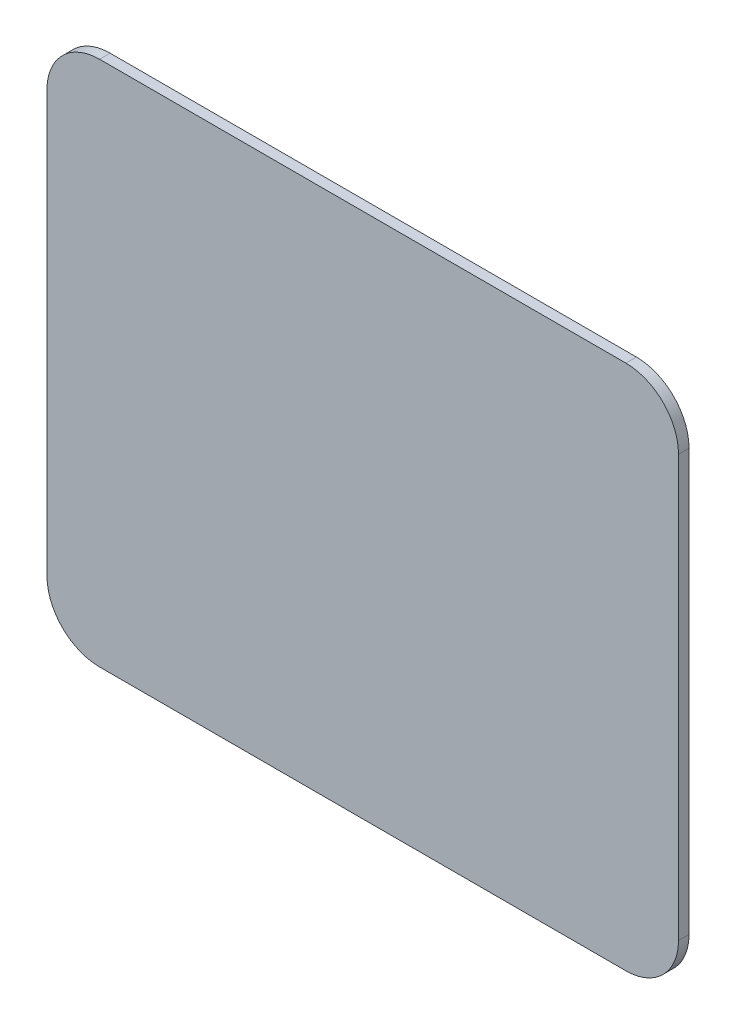
ISO-10303-21;
HEADER;
FILE_DESCRIPTION(('STEP AP214'),'2;1');
FILE_NAME('part.step','',(''),(''),'','','');
FILE_SCHEMA(('AUTOMOTIVE_DESIGN { 1 0 10303 214 1 1 1 1 }'));
ENDSEC;
DATA;
#1=APPLICATION_CONTEXT('core data for automotive mechanical design processes');
#2=APPLICATION_PROTOCOL_DEFINITION('international standard','automotive_design',2000,#1);
#3=PRODUCT_CONTEXT('',#1,'mechanical');
#4=PRODUCT('Part','Part','',(#3));
#5=PRODUCT_RELATED_PRODUCT_CATEGORY('part','',(#4));
#6=PRODUCT_DEFINITION_FORMATION('','',#4);
#7=PRODUCT_DEFINITION_CONTEXT('part definition',#1,'design');
#8=PRODUCT_DEFINITION('design','',#6,#7);
#9=PRODUCT_DEFINITION_SHAPE('','',#8);
#10=(LENGTH_UNIT() NAMED_UNIT(*) SI_UNIT(.MILLI.,.METRE.));
#11=(NAMED_UNIT(*) PLANE_ANGLE_UNIT() SI_UNIT($,.RADIAN.));
#12=(NAMED_UNIT(*) SI_UNIT($,.STERADIAN.) SOLID_ANGLE_UNIT());
#13=UNCERTAINTY_MEASURE_WITH_UNIT(LENGTH_MEASURE(1.E-05),#10,'distance_accuracy_value','');
#14=(GEOMETRIC_REPRESENTATION_CONTEXT(3) GLOBAL_UNCERTAINTY_ASSIGNED_CONTEXT((#13)) GLOBAL_UNIT_ASSIGNED_CONTEXT((#10,
#11,#12)) REPRESENTATION_CONTEXT('',''));
#15=CARTESIAN_POINT('',(0.,0.,0.));
#16=DIRECTION('',(0.,0.,1.));
#17=DIRECTION('',(1.,0.,0.));
#18=AXIS2_PLACEMENT_3D('',#15,#16,#17);
#19=CARTESIAN_POINT('',(0.,0.,0.1));
#20=DIRECTION('',(0.,0.,1.));
#21=DIRECTION('',(1.,0.,0.));
#22=AXIS2_PLACEMENT_3D('',#19,#20,#21);
#23=PLANE('',#22);
#24=DIRECTION('',(1.,0.,0.));
#25=VECTOR('',#24,1.);
#26=CARTESIAN_POINT('',(2.5,2.5,0.1));
#27=LINE('',#26,#25);
#28=CARTESIAN_POINT('',(-2.5,2.5,0.1));
#29=VERTEX_POINT('',#28);
#30=CARTESIAN_POINT('',(2.5,2.5,0.1));
#31=VERTEX_POINT('',#30);
#32=EDGE_CURVE('E91',#29,#31,#27,.T.);
#33=ORIENTED_EDGE('',*,*,#32,.F.);
#34=CARTESIAN_POINT('',(-2.5,2.,0.1));
#35=DIRECTION('',(0.,0.,1.));
#36=DIRECTION('',(1.,0.,0.));
#37=AXIS2_PLACEMENT_3D('',#34,#35,#36);
#38=CIRCLE('',#37,0.5);
#39=CARTESIAN_POINT('',(-3.,2.,0.1));
#40=VERTEX_POINT('',#39);
#41=EDGE_CURVE('E19',#40,#29,#38,.F.);
#42=ORIENTED_EDGE('',*,*,#41,.F.);
#43=DIRECTION('',(0.,1.,0.));
#44=VECTOR('',#43,1.);
#45=CARTESIAN_POINT('',(-3.,2.,0.1));
#46=LINE('',#45,#44);
#47=CARTESIAN_POINT('',(-3.,-2.,0.1));
#48=VERTEX_POINT('',#47);
#49=EDGE_CURVE('E77',#48,#40,#46,.T.);
#50=ORIENTED_EDGE('',*,*,#49,.F.);
#51=CARTESIAN_POINT('',(-2.5,-2.,0.1));
#52=DIRECTION('',(0.,0.,1.));
#53=DIRECTION('',(1.,0.,0.));
#54=AXIS2_PLACEMENT_3D('',#51,#52,#53);
#55=CIRCLE('',#54,0.5);
#56=CARTESIAN_POINT('',(-2.5,-2.5,0.1));
#57=VERTEX_POINT('',#56);
#58=EDGE_CURVE('E98',#57,#48,#55,.F.);
#59=ORIENTED_EDGE('',*,*,#58,.F.);
#60=DIRECTION('',(1.,0.,0.));
#61=VECTOR('',#60,1.);
#62=CARTESIAN_POINT('',(-2.5,-2.5,0.1));
#63=LINE('',#62,#61);
#64=CARTESIAN_POINT('',(2.5,-2.5,0.1));
#65=VERTEX_POINT('',#64);
#66=EDGE_CURVE('E109',#65,#57,#63,.F.);
#67=ORIENTED_EDGE('',*,*,#66,.F.);
#68=CARTESIAN_POINT('',(2.5,-2.,0.1));
#69=DIRECTION('',(0.,0.,1.));
#70=DIRECTION('',(1.,0.,0.));
#71=AXIS2_PLACEMENT_3D('',#68,#69,#70);
#72=CIRCLE('',#71,0.5);
#73=CARTESIAN_POINT('',(3.,-2.,0.1));
#74=VERTEX_POINT('',#73);
#75=EDGE_CURVE('E127',#74,#65,#72,.F.);
#76=ORIENTED_EDGE('',*,*,#75,.F.);
#77=DIRECTION('',(0.,1.,0.));
#78=VECTOR('',#77,1.);
#79=CARTESIAN_POINT('',(3.,-2.,0.1));
#80=LINE('',#79,#78);
#81=CARTESIAN_POINT('',(3.,2.,0.1));
#82=VERTEX_POINT('',#81);
#83=EDGE_CURVE('E105',#82,#74,#80,.F.);
#84=ORIENTED_EDGE('',*,*,#83,.F.);
#85=CARTESIAN_POINT('',(2.5,2.,0.1));
#86=DIRECTION('',(0.,0.,1.));
#87=DIRECTION('',(1.,0.,0.));
#88=AXIS2_PLACEMENT_3D('',#85,#86,#87);
#89=CIRCLE('',#88,0.5);
#90=EDGE_CURVE('E124',#31,#82,#89,.F.);
#91=ORIENTED_EDGE('',*,*,#90,.F.);
#92=EDGE_LOOP('',(#33,#42,#50,#59,#67,#76,#84,#91));
#93=FACE_BOUND('',#92,.T.);
#94=ADVANCED_FACE('F16',(#93),#23,.T.);
#95=CARTESIAN_POINT('',(-2.5,2.,0.));
#96=DIRECTION('',(0.,0.,1.));
#97=DIRECTION('',(1.,0.,0.));
#98=AXIS2_PLACEMENT_3D('',#95,#96,#97);
#99=CYLINDRICAL_SURFACE('',#98,0.5);
#100=DIRECTION('',(0.,0.,1.));
#101=VECTOR('',#100,1.);
#102=CARTESIAN_POINT('',(-2.5,2.5,0.));
#103=LINE('',#102,#101);
#104=CARTESIAN_POINT('',(-2.5,2.5,0.));
#105=VERTEX_POINT('',#104);
#106=EDGE_CURVE('E104',#105,#29,#103,.T.);
#107=ORIENTED_EDGE('',*,*,#106,.F.);
#108=CARTESIAN_POINT('',(-2.5,2.,0.));
#109=DIRECTION('',(0.,0.,1.));
#110=DIRECTION('',(1.,0.,0.));
#111=AXIS2_PLACEMENT_3D('',#108,#109,#110);
#112=CIRCLE('',#111,0.5);
#113=CARTESIAN_POINT('',(-3.,2.,0.));
#114=VERTEX_POINT('',#113);
#115=EDGE_CURVE('E97',#105,#114,#112,.T.);
#116=ORIENTED_EDGE('',*,*,#115,.T.);
#117=DIRECTION('',(0.,0.,1.));
#118=VECTOR('',#117,1.);
#119=CARTESIAN_POINT('',(-3.,2.,0.));
#120=LINE('',#119,#118);
#121=EDGE_CURVE('E82',#40,#114,#120,.F.);
#122=ORIENTED_EDGE('',*,*,#121,.F.);
#123=ORIENTED_EDGE('',*,*,#41,.T.);
#124=EDGE_LOOP('',(#107,#116,#122,#123));
#125=FACE_BOUND('',#124,.T.);
#126=ADVANCED_FACE('F96',(#125),#99,.T.);
#127=CARTESIAN_POINT('',(-3.,2.,0.));
#128=DIRECTION('',(-1.,0.,0.));
#129=DIRECTION('',(0.,0.,1.));
#130=AXIS2_PLACEMENT_3D('',#127,#128,#129);
#131=PLANE('',#130);
#132=ORIENTED_EDGE('',*,*,#121,.T.);
#133=DIRECTION('',(0.,1.,0.));
#134=VECTOR('',#133,1.);
#135=CARTESIAN_POINT('',(-3.,0.,0.));
#136=LINE('',#135,#134);
#137=CARTESIAN_POINT('',(-3.,-2.,0.));
#138=VERTEX_POINT('',#137);
#139=EDGE_CURVE('E122',#114,#138,#136,.F.);
#140=ORIENTED_EDGE('',*,*,#139,.T.);
#141=DIRECTION('',(0.,0.,1.));
#142=VECTOR('',#141,1.);
#143=CARTESIAN_POINT('',(-3.,-2.,0.));
#144=LINE('',#143,#142);
#145=EDGE_CURVE('E84',#48,#138,#144,.F.);
#146=ORIENTED_EDGE('',*,*,#145,.F.);
#147=ORIENTED_EDGE('',*,*,#49,.T.);
#148=EDGE_LOOP('',(#132,#140,#146,#147));
#149=FACE_BOUND('',#148,.T.);
#150=ADVANCED_FACE('F79',(#149),#131,.T.);
#151=CARTESIAN_POINT('',(-2.5,-2.,0.));
#152=DIRECTION('',(0.,0.,1.));
#153=DIRECTION('',(1.,0.,0.));
#154=AXIS2_PLACEMENT_3D('',#151,#152,#153);
#155=CYLINDRICAL_SURFACE('',#154,0.5);
#156=ORIENTED_EDGE('',*,*,#145,.T.);
#157=CARTESIAN_POINT('',(-2.5,-2.,0.));
#158=DIRECTION('',(0.,0.,1.));
#159=DIRECTION('',(1.,0.,0.));
#160=AXIS2_PLACEMENT_3D('',#157,#158,#159);
#161=CIRCLE('',#160,0.5);
#162=CARTESIAN_POINT('',(-2.5,-2.5,0.));
#163=VERTEX_POINT('',#162);
#164=EDGE_CURVE('E119',#138,#163,#161,.T.);
#165=ORIENTED_EDGE('',*,*,#164,.T.);
#166=DIRECTION('',(0.,0.,-1.));
#167=VECTOR('',#166,1.);
#168=CARTESIAN_POINT('',(-2.5,-2.5,0.));
#169=LINE('',#168,#167);
#170=EDGE_CURVE('E110',#57,#163,#169,.T.);
#171=ORIENTED_EDGE('',*,*,#170,.F.);
#172=ORIENTED_EDGE('',*,*,#58,.T.);
#173=EDGE_LOOP('',(#156,#165,#171,#172));
#174=FACE_BOUND('',#173,.T.);
#175=ADVANCED_FACE('F158',(#174),#155,.T.);
#176=CARTESIAN_POINT('',(-2.5,-2.5,0.));
#177=DIRECTION('',(0.,-1.,0.));
#178=DIRECTION('',(0.,0.,-1.));
#179=AXIS2_PLACEMENT_3D('',#176,#177,#178);
#180=PLANE('',#179);
#181=ORIENTED_EDGE('',*,*,#170,.T.);
#182=DIRECTION('',(1.,0.,0.));
#183=VECTOR('',#182,1.);
#184=CARTESIAN_POINT('',(0.,-2.5,0.));
#185=LINE('',#184,#183);
#186=CARTESIAN_POINT('',(2.5,-2.5,0.));
#187=VERTEX_POINT('',#186);
#188=EDGE_CURVE('E118',#163,#187,#185,.T.);
#189=ORIENTED_EDGE('',*,*,#188,.T.);
#190=DIRECTION('',(0.,0.,1.));
#191=VECTOR('',#190,1.);
#192=CARTESIAN_POINT('',(2.5,-2.5,0.));
#193=LINE('',#192,#191);
#194=EDGE_CURVE('E108',#65,#187,#193,.F.);
#195=ORIENTED_EDGE('',*,*,#194,.F.);
#196=ORIENTED_EDGE('',*,*,#66,.T.);
#197=EDGE_LOOP('',(#181,#189,#195,#196));
#198=FACE_BOUND('',#197,.T.);
#199=ADVANCED_FACE('F155',(#198),#180,.T.);
#200=CARTESIAN_POINT('',(2.5,-2.,0.));
#201=DIRECTION('',(0.,0.,1.));
#202=DIRECTION('',(1.,0.,0.));
#203=AXIS2_PLACEMENT_3D('',#200,#201,#202);
#204=CYLINDRICAL_SURFACE('',#203,0.5);
#205=ORIENTED_EDGE('',*,*,#194,.T.);
#206=CARTESIAN_POINT('',(2.5,-2.,0.));
#207=DIRECTION('',(0.,0.,1.));
#208=DIRECTION('',(1.,0.,0.));
#209=AXIS2_PLACEMENT_3D('',#206,#207,#208);
#210=CIRCLE('',#209,0.5);
#211=CARTESIAN_POINT('',(3.,-2.,0.));
#212=VERTEX_POINT('',#211);
#213=EDGE_CURVE('E115',#187,#212,#210,.T.);
#214=ORIENTED_EDGE('',*,*,#213,.T.);
#215=DIRECTION('',(0.,0.,-1.));
#216=VECTOR('',#215,1.);
#217=CARTESIAN_POINT('',(3.,-2.,0.));
#218=LINE('',#217,#216);
#219=EDGE_CURVE('E107',#74,#212,#218,.T.);
#220=ORIENTED_EDGE('',*,*,#219,.F.);
#221=ORIENTED_EDGE('',*,*,#75,.T.);
#222=EDGE_LOOP('',(#205,#214,#220,#221));
#223=FACE_BOUND('',#222,.T.);
#224=ADVANCED_FACE('F153',(#223),#204,.T.);
#225=CARTESIAN_POINT('',(3.,-2.,0.));
#226=DIRECTION('',(1.,0.,0.));
#227=DIRECTION('',(0.,0.,-1.));
#228=AXIS2_PLACEMENT_3D('',#225,#226,#227);
#229=PLANE('',#228);
#230=ORIENTED_EDGE('',*,*,#219,.T.);
#231=DIRECTION('',(0.,1.,0.));
#232=VECTOR('',#231,1.);
#233=CARTESIAN_POINT('',(3.,0.,0.));
#234=LINE('',#233,#232);
#235=CARTESIAN_POINT('',(3.,2.,0.));
#236=VERTEX_POINT('',#235);
#237=EDGE_CURVE('E114',#212,#236,#234,.T.);
#238=ORIENTED_EDGE('',*,*,#237,.T.);
#239=DIRECTION('',(0.,0.,1.));
#240=VECTOR('',#239,1.);
#241=CARTESIAN_POINT('',(3.,2.,0.));
#242=LINE('',#241,#240);
#243=EDGE_CURVE('E126',#82,#236,#242,.F.);
#244=ORIENTED_EDGE('',*,*,#243,.F.);
#245=ORIENTED_EDGE('',*,*,#83,.T.);
#246=EDGE_LOOP('',(#230,#238,#244,#245));
#247=FACE_BOUND('',#246,.T.);
#248=ADVANCED_FACE('F148',(#247),#229,.T.);
#249=CARTESIAN_POINT('',(2.5,2.,0.));
#250=DIRECTION('',(0.,0.,1.));
#251=DIRECTION('',(1.,0.,0.));
#252=AXIS2_PLACEMENT_3D('',#249,#250,#251);
#253=CYLINDRICAL_SURFACE('',#252,0.5);
#254=ORIENTED_EDGE('',*,*,#243,.T.);
#255=CARTESIAN_POINT('',(2.5,2.,0.));
#256=DIRECTION('',(0.,0.,1.));
#257=DIRECTION('',(1.,0.,0.));
#258=AXIS2_PLACEMENT_3D('',#255,#256,#257);
#259=CIRCLE('',#258,0.5);
#260=CARTESIAN_POINT('',(2.5,2.5,0.));
#261=VERTEX_POINT('',#260);
#262=EDGE_CURVE('E25',#236,#261,#259,.T.);
#263=ORIENTED_EDGE('',*,*,#262,.T.);
#264=DIRECTION('',(0.,0.,1.));
#265=VECTOR('',#264,1.);
#266=CARTESIAN_POINT('',(2.5,2.5,0.));
#267=LINE('',#266,#265);
#268=EDGE_CURVE('E33',#31,#261,#267,.F.);
#269=ORIENTED_EDGE('',*,*,#268,.F.);
#270=ORIENTED_EDGE('',*,*,#90,.T.);
#271=EDGE_LOOP('',(#254,#263,#269,#270));
#272=FACE_BOUND('',#271,.T.);
#273=ADVANCED_FACE('F161',(#272),#253,.T.);
#274=CARTESIAN_POINT('',(2.5,2.5,0.));
#275=DIRECTION('',(0.,1.,0.));
#276=DIRECTION('',(0.,0.,1.));
#277=AXIS2_PLACEMENT_3D('',#274,#275,#276);
#278=PLANE('',#277);
#279=ORIENTED_EDGE('',*,*,#268,.T.);
#280=DIRECTION('',(1.,0.,0.));
#281=VECTOR('',#280,1.);
#282=CARTESIAN_POINT('',(0.,2.5,0.));
#283=LINE('',#282,#281);
#284=EDGE_CURVE('E11',#261,#105,#283,.F.);
#285=ORIENTED_EDGE('',*,*,#284,.T.);
#286=ORIENTED_EDGE('',*,*,#106,.T.);
#287=ORIENTED_EDGE('',*,*,#32,.T.);
#288=EDGE_LOOP('',(#279,#285,#286,#287));
#289=FACE_BOUND('',#288,.T.);
#290=ADVANCED_FACE('F163',(#289),#278,.T.);
#291=CARTESIAN_POINT('',(0.,0.,0.));
#292=DIRECTION('',(0.,0.,1.));
#293=DIRECTION('',(1.,0.,0.));
#294=AXIS2_PLACEMENT_3D('',#291,#292,#293);
#295=PLANE('',#294);
#296=ORIENTED_EDGE('',*,*,#262,.F.);
#297=ORIENTED_EDGE('',*,*,#237,.F.);
#298=ORIENTED_EDGE('',*,*,#213,.F.);
#299=ORIENTED_EDGE('',*,*,#188,.F.);
#300=ORIENTED_EDGE('',*,*,#164,.F.);
#301=ORIENTED_EDGE('',*,*,#139,.F.);
#302=ORIENTED_EDGE('',*,*,#115,.F.);
#303=ORIENTED_EDGE('',*,*,#284,.F.);
#304=EDGE_LOOP('',(#296,#297,#298,#299,#300,#301,#302,#303));
#305=FACE_BOUND('',#304,.T.);
#306=ADVANCED_FACE('F152',(#305),#295,.F.);
#307=CLOSED_SHELL('',(#94,#126,#150,#175,#199,#224,#248,#273,#290,#306));
#308=MANIFOLD_SOLID_BREP('B1',#307);
#309=ADVANCED_BREP_SHAPE_REPRESENTATION('',(#18,#308),#14);
#310=SHAPE_DEFINITION_REPRESENTATION(#9,#309);
ENDSEC;
END-ISO-10303-21;
